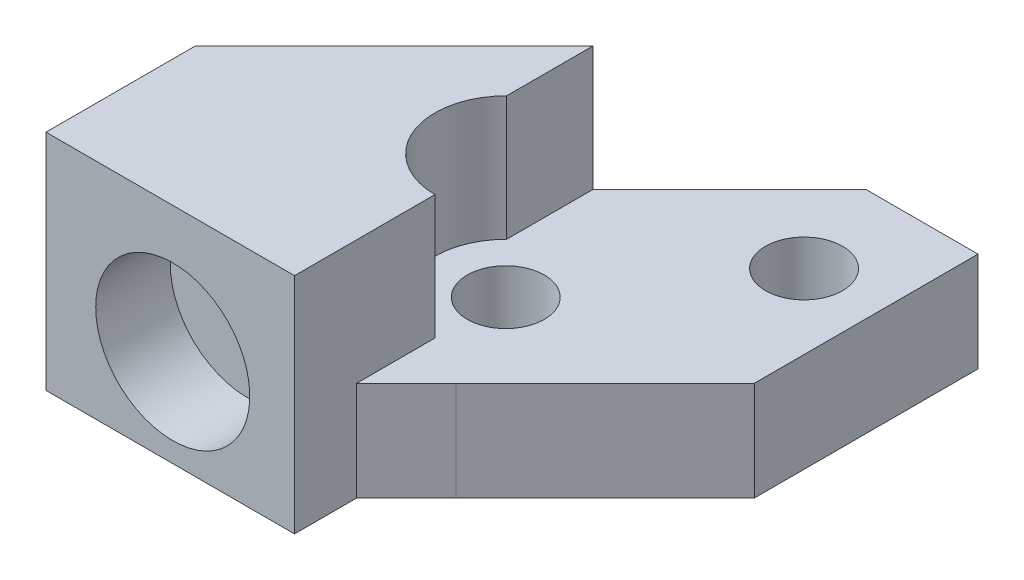
ISO-10303-21;
HEADER;
FILE_DESCRIPTION(('STEP AP214'),'2;1');
FILE_NAME('part.step','',(''),(''),'','','');
FILE_SCHEMA(('AUTOMOTIVE_DESIGN { 1 0 10303 214 1 1 1 1 }'));
ENDSEC;
DATA;
#1=APPLICATION_CONTEXT('core data for automotive mechanical design processes');
#2=APPLICATION_PROTOCOL_DEFINITION('international standard','automotive_design',2000,#1);
#3=PRODUCT_CONTEXT('',#1,'mechanical');
#4=PRODUCT('Part','Part','',(#3));
#5=PRODUCT_RELATED_PRODUCT_CATEGORY('part','',(#4));
#6=PRODUCT_DEFINITION_FORMATION('','',#4);
#7=PRODUCT_DEFINITION_CONTEXT('part definition',#1,'design');
#8=PRODUCT_DEFINITION('design','',#6,#7);
#9=PRODUCT_DEFINITION_SHAPE('','',#8);
#10=(LENGTH_UNIT() NAMED_UNIT(*) SI_UNIT(.MILLI.,.METRE.));
#11=(NAMED_UNIT(*) PLANE_ANGLE_UNIT() SI_UNIT($,.RADIAN.));
#12=(NAMED_UNIT(*) SI_UNIT($,.STERADIAN.) SOLID_ANGLE_UNIT());
#13=UNCERTAINTY_MEASURE_WITH_UNIT(LENGTH_MEASURE(1.E-05),#10,'distance_accuracy_value','');
#14=(GEOMETRIC_REPRESENTATION_CONTEXT(3) GLOBAL_UNCERTAINTY_ASSIGNED_CONTEXT((#13)) GLOBAL_UNIT_ASSIGNED_CONTEXT((#10,
#11,#12)) REPRESENTATION_CONTEXT('',''));
#15=CARTESIAN_POINT('',(0.,0.,0.));
#16=DIRECTION('',(0.,0.,1.));
#17=DIRECTION('',(1.,0.,0.));
#18=AXIS2_PLACEMENT_3D('',#15,#16,#17);
#19=CARTESIAN_POINT('',(0.,0.,0.));
#20=DIRECTION('',(1.,0.,0.));
#21=DIRECTION('',(0.,0.,1.));
#22=AXIS2_PLACEMENT_3D('',#19,#20,#21);
#23=PLANE('',#22);
#24=DIRECTION('',(0.,0.,1.));
#25=VECTOR('',#24,1.);
#26=CARTESIAN_POINT('',(0.,9.,5.));
#27=LINE('',#26,#25);
#28=CARTESIAN_POINT('',(0.,9.,5.50000000000005));
#29=VERTEX_POINT('',#28);
#30=CARTESIAN_POINT('',(0.,9.,8.96960594957531));
#31=VERTEX_POINT('',#30);
#32=EDGE_CURVE('E170',#29,#31,#27,.T.);
#33=ORIENTED_EDGE('',*,*,#32,.T.);
#34=DIRECTION('',(0.,-1.,0.));
#35=VECTOR('',#34,1.);
#36=CARTESIAN_POINT('',(0.,9.,8.96960594957531));
#37=LINE('',#36,#35);
#38=CARTESIAN_POINT('',(0.,4.,8.96960594957531));
#39=VERTEX_POINT('',#38);
#40=EDGE_CURVE('E258',#39,#31,#37,.F.);
#41=ORIENTED_EDGE('',*,*,#40,.F.);
#42=DIRECTION('',(0.,0.,-1.));
#43=VECTOR('',#42,1.);
#44=CARTESIAN_POINT('',(0.,4.,0.));
#45=LINE('',#44,#43);
#46=CARTESIAN_POINT('',(0.,4.,5.50000000000005));
#47=VERTEX_POINT('',#46);
#48=EDGE_CURVE('E137',#39,#47,#45,.T.);
#49=ORIENTED_EDGE('',*,*,#48,.T.);
#50=DIRECTION('',(0.,1.,0.));
#51=VECTOR('',#50,1.);
#52=CARTESIAN_POINT('',(0.,0.,5.50000000000005));
#53=LINE('',#52,#51);
#54=EDGE_CURVE('E216',#29,#47,#53,.F.);
#55=ORIENTED_EDGE('',*,*,#54,.F.);
#56=EDGE_LOOP('',(#33,#41,#49,#55));
#57=FACE_BOUND('',#56,.T.);
#58=ADVANCED_FACE('F37',(#57),#23,.T.);
#59=CARTESIAN_POINT('',(2.,0.,0.));
#60=DIRECTION('',(-1.,0.,0.));
#61=DIRECTION('',(0.,0.,-1.));
#62=AXIS2_PLACEMENT_3D('',#59,#60,#61);
#63=PLANE('',#62);
#64=DIRECTION('',(0.,0.,1.));
#65=VECTOR('',#64,1.);
#66=CARTESIAN_POINT('',(2.,4.,0.));
#67=LINE('',#66,#65);
#68=CARTESIAN_POINT('',(2.,4.,13.85));
#69=VERTEX_POINT('',#68);
#70=CARTESIAN_POINT('',(2.,4.,17.));
#71=VERTEX_POINT('',#70);
#72=EDGE_CURVE('E134',#69,#71,#67,.T.);
#73=ORIENTED_EDGE('',*,*,#72,.F.);
#74=DIRECTION('',(0.,-1.,0.));
#75=VECTOR('',#74,1.);
#76=CARTESIAN_POINT('',(2.,9.,13.85));
#77=LINE('',#76,#75);
#78=CARTESIAN_POINT('',(2.,9.,13.85));
#79=VERTEX_POINT('',#78);
#80=EDGE_CURVE('E144',#69,#79,#77,.F.);
#81=ORIENTED_EDGE('',*,*,#80,.T.);
#82=DIRECTION('',(0.,0.,-1.));
#83=VECTOR('',#82,1.);
#84=CARTESIAN_POINT('',(2.,9.,19.5));
#85=LINE('',#84,#83);
#86=CARTESIAN_POINT('',(2.,9.,19.5));
#87=VERTEX_POINT('',#86);
#88=EDGE_CURVE('E160',#87,#79,#85,.T.);
#89=ORIENTED_EDGE('',*,*,#88,.F.);
#90=DIRECTION('',(0.,1.,0.));
#91=VECTOR('',#90,1.);
#92=CARTESIAN_POINT('',(2.,9.,19.5));
#93=LINE('',#92,#91);
#94=CARTESIAN_POINT('',(2.,0.,19.5));
#95=VERTEX_POINT('',#94);
#96=EDGE_CURVE('E267',#95,#87,#93,.T.);
#97=ORIENTED_EDGE('',*,*,#96,.F.);
#98=DIRECTION('',(0.,0.,1.));
#99=VECTOR('',#98,1.);
#100=CARTESIAN_POINT('',(2.,0.,19.5));
#101=LINE('',#100,#99);
#102=CARTESIAN_POINT('',(2.,0.,17.));
#103=VERTEX_POINT('',#102);
#104=EDGE_CURVE('E156',#103,#95,#101,.T.);
#105=ORIENTED_EDGE('',*,*,#104,.F.);
#106=DIRECTION('',(0.,-1.,0.));
#107=VECTOR('',#106,1.);
#108=CARTESIAN_POINT('',(2.,0.,17.));
#109=LINE('',#108,#107);
#110=EDGE_CURVE('E154',#71,#103,#109,.T.);
#111=ORIENTED_EDGE('',*,*,#110,.F.);
#112=EDGE_LOOP('',(#73,#81,#89,#97,#105,#111));
#113=FACE_BOUND('',#112,.T.);
#114=ADVANCED_FACE('F152',(#113),#63,.F.);
#115=CARTESIAN_POINT('',(0.,4.,0.));
#116=DIRECTION('',(0.,-1.,0.));
#117=DIRECTION('',(0.,0.,1.));
#118=AXIS2_PLACEMENT_3D('',#115,#116,#117);
#119=PLANE('',#118);
#120=DIRECTION('',(0.,0.,1.));
#121=VECTOR('',#120,1.);
#122=CARTESIAN_POINT('',(10.,4.,0.));
#123=LINE('',#122,#121);
#124=CARTESIAN_POINT('',(10.,4.,0.));
#125=VERTEX_POINT('',#124);
#126=CARTESIAN_POINT('',(10.,4.,8.99999999999998));
#127=VERTEX_POINT('',#126);
#128=EDGE_CURVE('E196',#125,#127,#123,.T.);
#129=ORIENTED_EDGE('',*,*,#128,.F.);
#130=DIRECTION('',(1.,0.,0.));
#131=VECTOR('',#130,1.);
#132=CARTESIAN_POINT('',(0.,4.,0.));
#133=LINE('',#132,#131);
#134=CARTESIAN_POINT('',(5.49999999999999,4.,0.));
#135=VERTEX_POINT('',#134);
#136=EDGE_CURVE('E192',#135,#125,#133,.T.);
#137=ORIENTED_EDGE('',*,*,#136,.F.);
#138=DIRECTION('',(-0.707106781186546,0.,0.707106781186549));
#139=VECTOR('',#138,1.);
#140=CARTESIAN_POINT('',(5.49999999999999,4.,0.));
#141=LINE('',#140,#139);
#142=EDGE_CURVE('E226',#47,#135,#141,.F.);
#143=ORIENTED_EDGE('',*,*,#142,.F.);
#144=ORIENTED_EDGE('',*,*,#48,.F.);
#145=CARTESIAN_POINT('',(2.,4.,11.));
#146=DIRECTION('',(0.,-1.,0.));
#147=DIRECTION('',(0.,0.,-1.));
#148=AXIS2_PLACEMENT_3D('',#145,#146,#147);
#149=CIRCLE('',#148,2.85);
#150=EDGE_CURVE('E128',#69,#39,#149,.T.);
#151=ORIENTED_EDGE('',*,*,#150,.F.);
#152=ORIENTED_EDGE('',*,*,#72,.T.);
#153=DIRECTION('',(0.707106781186544,0.,-0.707106781186551));
#154=VECTOR('',#153,1.);
#155=CARTESIAN_POINT('',(9.50000000000002,4.,9.49999999999992));
#156=LINE('',#155,#154);
#157=CARTESIAN_POINT('',(4.,4.,15.));
#158=VERTEX_POINT('',#157);
#159=EDGE_CURVE('E11',#158,#71,#156,.F.);
#160=ORIENTED_EDGE('',*,*,#159,.F.);
#161=DIRECTION('',(0.707106781186546,0.,-0.707106781186549));
#162=VECTOR('',#161,1.);
#163=CARTESIAN_POINT('',(4.,4.,15.));
#164=LINE('',#163,#162);
#165=EDGE_CURVE('E236',#127,#158,#164,.F.);
#166=ORIENTED_EDGE('',*,*,#165,.F.);
#167=EDGE_LOOP('',(#129,#137,#143,#144,#151,#152,#160,#166));
#168=FACE_BOUND('',#167,.T.);
#169=CARTESIAN_POINT('',(7.,4.,4.));
#170=DIRECTION('',(0.,-1.,0.));
#171=DIRECTION('',(0.,0.,-1.));
#172=AXIS2_PLACEMENT_3D('',#169,#170,#171);
#173=CIRCLE('',#172,1.55);
#174=CARTESIAN_POINT('',(7.,4.,2.45));
#175=VERTEX_POINT('',#174);
#176=EDGE_CURVE('E185',#175,#175,#173,.T.);
#177=ORIENTED_EDGE('',*,*,#176,.T.);
#178=EDGE_LOOP('',(#177));
#179=FACE_BOUND('',#178,.T.);
#180=CARTESIAN_POINT('',(2.,4.,11.));
#181=DIRECTION('',(0.,-1.,0.));
#182=DIRECTION('',(0.,0.,-1.));
#183=AXIS2_PLACEMENT_3D('',#180,#181,#182);
#184=CIRCLE('',#183,1.55);
#185=CARTESIAN_POINT('',(2.,4.,9.45));
#186=VERTEX_POINT('',#185);
#187=EDGE_CURVE('E179',#186,#186,#184,.T.);
#188=ORIENTED_EDGE('',*,*,#187,.T.);
#189=EDGE_LOOP('',(#188));
#190=FACE_BOUND('',#189,.T.);
#191=ADVANCED_FACE('F131',(#168,#179,#190),#119,.F.);
#192=CARTESIAN_POINT('',(2.,4.,11.));
#193=DIRECTION('',(0.,-1.,0.));
#194=DIRECTION('',(0.,0.,1.));
#195=AXIS2_PLACEMENT_3D('',#192,#193,#194);
#196=CYLINDRICAL_SURFACE('',#195,1.55);
#197=CARTESIAN_POINT('',(2.,0.,11.));
#198=DIRECTION('',(0.,-1.,0.));
#199=DIRECTION('',(0.,0.,-1.));
#200=AXIS2_PLACEMENT_3D('',#197,#198,#199);
#201=CIRCLE('',#200,1.55);
#202=CARTESIAN_POINT('',(2.,0.,9.45));
#203=VERTEX_POINT('',#202);
#204=EDGE_CURVE('E178',#203,#203,#201,.T.);
#205=ORIENTED_EDGE('',*,*,#204,.T.);
#206=EDGE_LOOP('',(#205));
#207=FACE_BOUND('',#206,.T.);
#208=ORIENTED_EDGE('',*,*,#187,.F.);
#209=EDGE_LOOP('',(#208));
#210=FACE_BOUND('',#209,.T.);
#211=ADVANCED_FACE('F311',(#207,#210),#196,.F.);
#212=CARTESIAN_POINT('',(0.,0.,0.));
#213=DIRECTION('',(0.,-1.,0.));
#214=DIRECTION('',(0.,0.,1.));
#215=AXIS2_PLACEMENT_3D('',#212,#213,#214);
#216=PLANE('',#215);
#217=ORIENTED_EDGE('',*,*,#204,.F.);
#218=EDGE_LOOP('',(#217));
#219=FACE_BOUND('',#218,.T.);
#220=ORIENTED_EDGE('',*,*,#104,.T.);
#221=DIRECTION('',(1.,0.,0.));
#222=VECTOR('',#221,1.);
#223=CARTESIAN_POINT('',(-6.,0.,19.5));
#224=LINE('',#223,#222);
#225=CARTESIAN_POINT('',(-8.,0.,19.5));
#226=VERTEX_POINT('',#225);
#227=EDGE_CURVE('E174',#226,#95,#224,.T.);
#228=ORIENTED_EDGE('',*,*,#227,.F.);
#229=DIRECTION('',(0.,0.,-1.));
#230=VECTOR('',#229,1.);
#231=CARTESIAN_POINT('',(-8.,0.,19.5));
#232=LINE('',#231,#230);
#233=CARTESIAN_POINT('',(-8.,0.,13.5));
#234=VERTEX_POINT('',#233);
#235=EDGE_CURVE('E165',#226,#234,#232,.T.);
#236=ORIENTED_EDGE('',*,*,#235,.T.);
#237=DIRECTION('',(-0.707106781186549,0.,0.707106781186546));
#238=VECTOR('',#237,1.);
#239=CARTESIAN_POINT('',(2.75000000000001,0.,2.75000000000002));
#240=LINE('',#239,#238);
#241=CARTESIAN_POINT('',(-6.,0.,11.5));
#242=VERTEX_POINT('',#241);
#243=EDGE_CURVE('E208',#242,#234,#240,.T.);
#244=ORIENTED_EDGE('',*,*,#243,.F.);
#245=DIRECTION('',(0.707106781186544,0.,-0.707106781186551));
#246=VECTOR('',#245,1.);
#247=CARTESIAN_POINT('',(2.75000000000002,0.,2.74999999999999));
#248=LINE('',#247,#246);
#249=CARTESIAN_POINT('',(0.,0.,5.50000000000005));
#250=VERTEX_POINT('',#249);
#251=EDGE_CURVE('E213',#250,#242,#248,.F.);
#252=ORIENTED_EDGE('',*,*,#251,.F.);
#253=DIRECTION('',(0.707106781186546,0.,-0.707106781186549));
#254=VECTOR('',#253,1.);
#255=CARTESIAN_POINT('',(2.75000000000001,0.,2.75));
#256=LINE('',#255,#254);
#257=CARTESIAN_POINT('',(5.49999999999999,0.,0.));
#258=VERTEX_POINT('',#257);
#259=EDGE_CURVE('E223',#258,#250,#256,.F.);
#260=ORIENTED_EDGE('',*,*,#259,.F.);
#261=DIRECTION('',(1.,0.,0.));
#262=VECTOR('',#261,1.);
#263=CARTESIAN_POINT('',(0.,0.,0.));
#264=LINE('',#263,#262);
#265=CARTESIAN_POINT('',(10.,0.,0.));
#266=VERTEX_POINT('',#265);
#267=EDGE_CURVE('E188',#258,#266,#264,.T.);
#268=ORIENTED_EDGE('',*,*,#267,.T.);
#269=DIRECTION('',(0.,0.,1.));
#270=VECTOR('',#269,1.);
#271=CARTESIAN_POINT('',(10.,0.,0.));
#272=LINE('',#271,#270);
#273=CARTESIAN_POINT('',(10.,0.,8.99999999999998));
#274=VERTEX_POINT('',#273);
#275=EDGE_CURVE('E193',#266,#274,#272,.T.);
#276=ORIENTED_EDGE('',*,*,#275,.T.);
#277=DIRECTION('',(-0.707106781186546,0.,0.707106781186549));
#278=VECTOR('',#277,1.);
#279=CARTESIAN_POINT('',(9.50000000000001,0.,9.49999999999998));
#280=LINE('',#279,#278);
#281=CARTESIAN_POINT('',(4.,0.,15.));
#282=VERTEX_POINT('',#281);
#283=EDGE_CURVE('E231',#282,#274,#280,.F.);
#284=ORIENTED_EDGE('',*,*,#283,.F.);
#285=DIRECTION('',(-0.707106781186544,0.,0.707106781186551));
#286=VECTOR('',#285,1.);
#287=CARTESIAN_POINT('',(2.,0.,17.));
#288=LINE('',#287,#286);
#289=EDGE_CURVE('E45',#103,#282,#288,.F.);
#290=ORIENTED_EDGE('',*,*,#289,.F.);
#291=EDGE_LOOP('',(#220,#228,#236,#244,#252,#260,#268,#276,#284,#290));
#292=FACE_BOUND('',#291,.T.);
#293=CARTESIAN_POINT('',(7.,0.,4.));
#294=DIRECTION('',(0.,-1.,0.));
#295=DIRECTION('',(0.,0.,-1.));
#296=AXIS2_PLACEMENT_3D('',#293,#294,#295);
#297=CIRCLE('',#296,1.55);
#298=CARTESIAN_POINT('',(7.,0.,2.45));
#299=VERTEX_POINT('',#298);
#300=EDGE_CURVE('E182',#299,#299,#297,.T.);
#301=ORIENTED_EDGE('',*,*,#300,.F.);
#302=EDGE_LOOP('',(#301));
#303=FACE_BOUND('',#302,.T.);
#304=ADVANCED_FACE('F239',(#219,#292,#303),#216,.T.);
#305=CARTESIAN_POINT('',(0.,4.,0.));
#306=DIRECTION('',(0.,0.,1.));
#307=DIRECTION('',(-1.,0.,0.));
#308=AXIS2_PLACEMENT_3D('',#305,#306,#307);
#309=PLANE('',#308);
#310=ORIENTED_EDGE('',*,*,#136,.T.);
#311=DIRECTION('',(0.,-1.,0.));
#312=VECTOR('',#311,1.);
#313=CARTESIAN_POINT('',(10.,4.,0.));
#314=LINE('',#313,#312);
#315=EDGE_CURVE('E150',#125,#266,#314,.T.);
#316=ORIENTED_EDGE('',*,*,#315,.T.);
#317=ORIENTED_EDGE('',*,*,#267,.F.);
#318=DIRECTION('',(0.,-1.,0.));
#319=VECTOR('',#318,1.);
#320=CARTESIAN_POINT('',(5.49999999999999,4.,0.));
#321=LINE('',#320,#319);
#322=EDGE_CURVE('E221',#135,#258,#321,.T.);
#323=ORIENTED_EDGE('',*,*,#322,.F.);
#324=EDGE_LOOP('',(#310,#316,#317,#323));
#325=FACE_BOUND('',#324,.T.);
#326=ADVANCED_FACE('F250',(#325),#309,.F.);
#327=CARTESIAN_POINT('',(10.,4.,0.));
#328=DIRECTION('',(-1.,0.,0.));
#329=DIRECTION('',(0.,0.,-1.));
#330=AXIS2_PLACEMENT_3D('',#327,#328,#329);
#331=PLANE('',#330);
#332=ORIENTED_EDGE('',*,*,#275,.F.);
#333=ORIENTED_EDGE('',*,*,#315,.F.);
#334=ORIENTED_EDGE('',*,*,#128,.T.);
#335=DIRECTION('',(0.,1.,0.));
#336=VECTOR('',#335,1.);
#337=CARTESIAN_POINT('',(10.,4.,8.99999999999998));
#338=LINE('',#337,#336);
#339=EDGE_CURVE('E234',#274,#127,#338,.T.);
#340=ORIENTED_EDGE('',*,*,#339,.F.);
#341=EDGE_LOOP('',(#332,#333,#334,#340));
#342=FACE_BOUND('',#341,.T.);
#343=ADVANCED_FACE('F247',(#342),#331,.F.);
#344=CARTESIAN_POINT('',(7.,4.,4.));
#345=DIRECTION('',(0.,-1.,0.));
#346=DIRECTION('',(0.,0.,1.));
#347=AXIS2_PLACEMENT_3D('',#344,#345,#346);
#348=CYLINDRICAL_SURFACE('',#347,1.55);
#349=ORIENTED_EDGE('',*,*,#176,.F.);
#350=EDGE_LOOP('',(#349));
#351=FACE_BOUND('',#350,.T.);
#352=ORIENTED_EDGE('',*,*,#300,.T.);
#353=EDGE_LOOP('',(#352));
#354=FACE_BOUND('',#353,.T.);
#355=ADVANCED_FACE('F310',(#351,#354),#348,.F.);
#356=CARTESIAN_POINT('',(-6.,9.,5.));
#357=DIRECTION('',(0.,-1.,0.));
#358=DIRECTION('',(0.,0.,1.));
#359=AXIS2_PLACEMENT_3D('',#356,#357,#358);
#360=PLANE('',#359);
#361=DIRECTION('',(0.707106781186549,0.,-0.707106781186546));
#362=VECTOR('',#361,1.);
#363=CARTESIAN_POINT('',(-8.,9.,13.5));
#364=LINE('',#363,#362);
#365=CARTESIAN_POINT('',(-8.,9.,13.5));
#366=VERTEX_POINT('',#365);
#367=CARTESIAN_POINT('',(-6.,9.,11.5));
#368=VERTEX_POINT('',#367);
#369=EDGE_CURVE('E205',#366,#368,#364,.T.);
#370=ORIENTED_EDGE('',*,*,#369,.F.);
#371=DIRECTION('',(0.,0.,1.));
#372=VECTOR('',#371,1.);
#373=CARTESIAN_POINT('',(-8.,9.,19.5));
#374=LINE('',#373,#372);
#375=CARTESIAN_POINT('',(-8.,9.,19.5));
#376=VERTEX_POINT('',#375);
#377=EDGE_CURVE('E168',#366,#376,#374,.T.);
#378=ORIENTED_EDGE('',*,*,#377,.T.);
#379=DIRECTION('',(1.,0.,0.));
#380=VECTOR('',#379,1.);
#381=CARTESIAN_POINT('',(-6.,9.,19.5));
#382=LINE('',#381,#380);
#383=EDGE_CURVE('E176',#376,#87,#382,.T.);
#384=ORIENTED_EDGE('',*,*,#383,.T.);
#385=ORIENTED_EDGE('',*,*,#88,.T.);
#386=CARTESIAN_POINT('',(2.,9.,11.));
#387=DIRECTION('',(0.,-1.,0.));
#388=DIRECTION('',(0.,0.,-1.));
#389=AXIS2_PLACEMENT_3D('',#386,#387,#388);
#390=CIRCLE('',#389,2.85);
#391=EDGE_CURVE('E141',#79,#31,#390,.T.);
#392=ORIENTED_EDGE('',*,*,#391,.T.);
#393=ORIENTED_EDGE('',*,*,#32,.F.);
#394=DIRECTION('',(-0.707106781186544,0.,0.707106781186551));
#395=VECTOR('',#394,1.);
#396=CARTESIAN_POINT('',(-6.,9.,11.5000000000001));
#397=LINE('',#396,#395);
#398=EDGE_CURVE('E211',#368,#29,#397,.F.);
#399=ORIENTED_EDGE('',*,*,#398,.F.);
#400=EDGE_LOOP('',(#370,#378,#384,#385,#392,#393,#399));
#401=FACE_BOUND('',#400,.T.);
#402=ADVANCED_FACE('F272',(#401),#360,.F.);
#403=CARTESIAN_POINT('',(-6.,9.,19.5));
#404=DIRECTION('',(0.,0.,-1.));
#405=DIRECTION('',(1.,0.,0.));
#406=AXIS2_PLACEMENT_3D('',#403,#404,#405);
#407=PLANE('',#406);
#408=CARTESIAN_POINT('',(-2.9,3.9,19.5));
#409=DIRECTION('',(0.,0.,-1.));
#410=DIRECTION('',(-1.,0.,0.));
#411=AXIS2_PLACEMENT_3D('',#408,#409,#410);
#412=CIRCLE('',#411,3.1);
#413=CARTESIAN_POINT('',(-6.,3.9,19.5));
#414=VERTEX_POINT('',#413);
#415=EDGE_CURVE('E259',#414,#414,#412,.T.);
#416=ORIENTED_EDGE('',*,*,#415,.T.);
#417=EDGE_LOOP('',(#416));
#418=FACE_BOUND('',#417,.T.);
#419=ORIENTED_EDGE('',*,*,#383,.F.);
#420=DIRECTION('',(0.,-1.,0.));
#421=VECTOR('',#420,1.);
#422=CARTESIAN_POINT('',(-8.,9.,19.5));
#423=LINE('',#422,#421);
#424=EDGE_CURVE('E158',#376,#226,#423,.T.);
#425=ORIENTED_EDGE('',*,*,#424,.T.);
#426=ORIENTED_EDGE('',*,*,#227,.T.);
#427=ORIENTED_EDGE('',*,*,#96,.T.);
#428=EDGE_LOOP('',(#419,#425,#426,#427));
#429=FACE_BOUND('',#428,.T.);
#430=ADVANCED_FACE('F276',(#418,#429),#407,.F.);
#431=CARTESIAN_POINT('',(-8.,0.,0.));
#432=DIRECTION('',(-1.,0.,0.));
#433=DIRECTION('',(0.,0.,-1.));
#434=AXIS2_PLACEMENT_3D('',#431,#432,#433);
#435=PLANE('',#434);
#436=ORIENTED_EDGE('',*,*,#235,.F.);
#437=ORIENTED_EDGE('',*,*,#424,.F.);
#438=ORIENTED_EDGE('',*,*,#377,.F.);
#439=DIRECTION('',(0.,1.,0.));
#440=VECTOR('',#439,1.);
#441=CARTESIAN_POINT('',(-8.,9.,13.5));
#442=LINE('',#441,#440);
#443=EDGE_CURVE('E149',#234,#366,#442,.T.);
#444=ORIENTED_EDGE('',*,*,#443,.F.);
#445=EDGE_LOOP('',(#436,#437,#438,#444));
#446=FACE_BOUND('',#445,.T.);
#447=ADVANCED_FACE('F282',(#446),#435,.T.);
#448=CARTESIAN_POINT('',(-2.9,3.9,16.5));
#449=DIRECTION('',(0.,0.,1.));
#450=DIRECTION('',(-1.,0.,0.));
#451=AXIS2_PLACEMENT_3D('',#448,#449,#450);
#452=CYLINDRICAL_SURFACE('',#451,3.1);
#453=CARTESIAN_POINT('',(-2.9,3.9,16.5));
#454=DIRECTION('',(0.,0.,-1.));
#455=DIRECTION('',(-1.,0.,0.));
#456=AXIS2_PLACEMENT_3D('',#453,#454,#455);
#457=CIRCLE('',#456,3.1);
#458=CARTESIAN_POINT('',(-6.,3.9,16.5));
#459=VERTEX_POINT('',#458);
#460=EDGE_CURVE('E262',#459,#459,#457,.T.);
#461=ORIENTED_EDGE('',*,*,#460,.T.);
#462=EDGE_LOOP('',(#461));
#463=FACE_BOUND('',#462,.T.);
#464=ORIENTED_EDGE('',*,*,#415,.F.);
#465=EDGE_LOOP('',(#464));
#466=FACE_BOUND('',#465,.T.);
#467=ADVANCED_FACE('F335',(#463,#466),#452,.F.);
#468=CARTESIAN_POINT('',(-2.9,3.9,16.5));
#469=DIRECTION('',(0.,0.,1.));
#470=DIRECTION('',(-1.,0.,0.));
#471=AXIS2_PLACEMENT_3D('',#468,#469,#470);
#472=PLANE('',#471);
#473=ORIENTED_EDGE('',*,*,#460,.F.);
#474=EDGE_LOOP('',(#473));
#475=FACE_BOUND('',#474,.T.);
#476=ADVANCED_FACE('F303',(#475),#472,.T.);
#477=CARTESIAN_POINT('',(2.,9.,11.));
#478=DIRECTION('',(0.,-1.,0.));
#479=DIRECTION('',(0.,0.,1.));
#480=AXIS2_PLACEMENT_3D('',#477,#478,#479);
#481=CYLINDRICAL_SURFACE('',#480,2.85);
#482=ORIENTED_EDGE('',*,*,#150,.T.);
#483=ORIENTED_EDGE('',*,*,#40,.T.);
#484=ORIENTED_EDGE('',*,*,#391,.F.);
#485=ORIENTED_EDGE('',*,*,#80,.F.);
#486=EDGE_LOOP('',(#482,#483,#484,#485));
#487=FACE_BOUND('',#486,.T.);
#488=ADVANCED_FACE('F145',(#487),#481,.F.);
#489=CARTESIAN_POINT('',(-8.,0.,13.5));
#490=DIRECTION('',(-0.707106781186546,0.,-0.707106781186549));
#491=DIRECTION('',(0.,-1.,0.));
#492=AXIS2_PLACEMENT_3D('',#489,#490,#491);
#493=PLANE('',#492);
#494=ORIENTED_EDGE('',*,*,#243,.T.);
#495=ORIENTED_EDGE('',*,*,#443,.T.);
#496=ORIENTED_EDGE('',*,*,#369,.T.);
#497=DIRECTION('',(0.,1.,0.));
#498=VECTOR('',#497,1.);
#499=CARTESIAN_POINT('',(-6.,9.,11.5));
#500=LINE('',#499,#498);
#501=EDGE_CURVE('E155',#242,#368,#500,.T.);
#502=ORIENTED_EDGE('',*,*,#501,.F.);
#503=EDGE_LOOP('',(#494,#495,#496,#502));
#504=FACE_BOUND('',#503,.T.);
#505=ADVANCED_FACE('F285',(#504),#493,.T.);
#506=CARTESIAN_POINT('',(-6.,0.,11.5000000000001));
#507=DIRECTION('',(0.707106781186551,0.,0.707106781186544));
#508=DIRECTION('',(0.,1.,0.));
#509=AXIS2_PLACEMENT_3D('',#506,#507,#508);
#510=PLANE('',#509);
#511=DIRECTION('',(0.,1.,0.));
#512=VECTOR('',#511,1.);
#513=CARTESIAN_POINT('',(0.,4.,5.50000000000005));
#514=LINE('',#513,#512);
#515=EDGE_CURVE('E219',#47,#250,#514,.F.);
#516=ORIENTED_EDGE('',*,*,#515,.T.);
#517=ORIENTED_EDGE('',*,*,#251,.T.);
#518=ORIENTED_EDGE('',*,*,#501,.T.);
#519=ORIENTED_EDGE('',*,*,#398,.T.);
#520=ORIENTED_EDGE('',*,*,#54,.T.);
#521=EDGE_LOOP('',(#516,#517,#518,#519,#520));
#522=FACE_BOUND('',#521,.T.);
#523=ADVANCED_FACE('F254',(#522),#510,.F.);
#524=CARTESIAN_POINT('',(5.49999999999999,4.,0.));
#525=DIRECTION('',(0.707106781186549,0.,0.707106781186546));
#526=DIRECTION('',(0.,-1.,0.));
#527=AXIS2_PLACEMENT_3D('',#524,#525,#526);
#528=PLANE('',#527);
#529=ORIENTED_EDGE('',*,*,#142,.T.);
#530=ORIENTED_EDGE('',*,*,#322,.T.);
#531=ORIENTED_EDGE('',*,*,#259,.T.);
#532=ORIENTED_EDGE('',*,*,#515,.F.);
#533=EDGE_LOOP('',(#529,#530,#531,#532));
#534=FACE_BOUND('',#533,.T.);
#535=ADVANCED_FACE('F287',(#534),#528,.F.);
#536=CARTESIAN_POINT('',(4.,4.,15.));
#537=DIRECTION('',(-0.707106781186549,0.,-0.707106781186546));
#538=DIRECTION('',(0.,-1.,0.));
#539=AXIS2_PLACEMENT_3D('',#536,#537,#538);
#540=PLANE('',#539);
#541=ORIENTED_EDGE('',*,*,#165,.T.);
#542=DIRECTION('',(0.,-1.,0.));
#543=VECTOR('',#542,1.);
#544=CARTESIAN_POINT('',(4.,4.,15.));
#545=LINE('',#544,#543);
#546=EDGE_CURVE('E229',#158,#282,#545,.T.);
#547=ORIENTED_EDGE('',*,*,#546,.T.);
#548=ORIENTED_EDGE('',*,*,#283,.T.);
#549=ORIENTED_EDGE('',*,*,#339,.T.);
#550=EDGE_LOOP('',(#541,#547,#548,#549));
#551=FACE_BOUND('',#550,.T.);
#552=ADVANCED_FACE('F243',(#551),#540,.F.);
#553=CARTESIAN_POINT('',(2.,0.,17.));
#554=DIRECTION('',(0.707106781186551,0.,0.707106781186544));
#555=DIRECTION('',(0.,1.,0.));
#556=AXIS2_PLACEMENT_3D('',#553,#554,#555);
#557=PLANE('',#556);
#558=ORIENTED_EDGE('',*,*,#159,.T.);
#559=ORIENTED_EDGE('',*,*,#110,.T.);
#560=ORIENTED_EDGE('',*,*,#289,.T.);
#561=ORIENTED_EDGE('',*,*,#546,.F.);
#562=EDGE_LOOP('',(#558,#559,#560,#561));
#563=FACE_BOUND('',#562,.T.);
#564=ADVANCED_FACE('F39',(#563),#557,.T.);
#565=CLOSED_SHELL('',(#58,#114,#191,#211,#304,#326,#343,#355,#402,#430,#447,#467,#476,#488,#505,
#523,#535,#552,#564));
#566=MANIFOLD_SOLID_BREP('B2',#565);
#567=ADVANCED_BREP_SHAPE_REPRESENTATION('',(#18,#566),#14);
#568=SHAPE_DEFINITION_REPRESENTATION(#9,#567);
ENDSEC;
END-ISO-10303-21;
